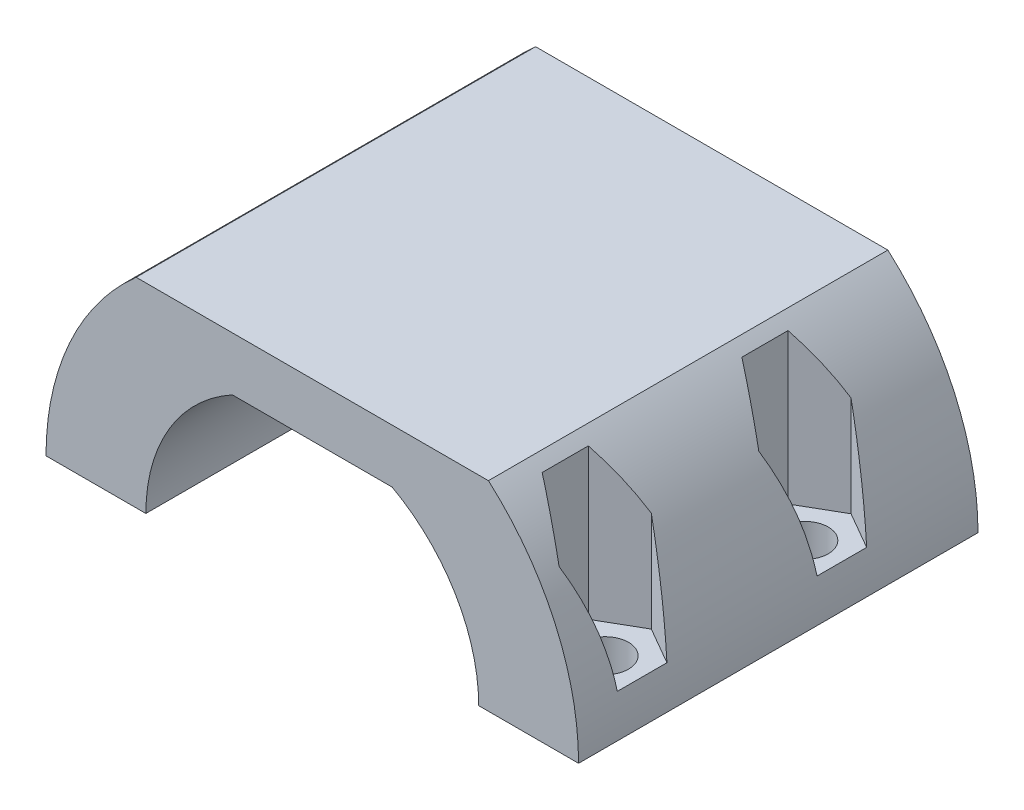
ISO-10303-21;
HEADER;
FILE_DESCRIPTION(('STEP AP214'),'2;1');
FILE_NAME('part.step','',(''),(''),'','','');
FILE_SCHEMA(('AUTOMOTIVE_DESIGN { 1 0 10303 214 1 1 1 1 }'));
ENDSEC;
DATA;
#1=APPLICATION_CONTEXT('core data for automotive mechanical design processes');
#2=APPLICATION_PROTOCOL_DEFINITION('international standard','automotive_design',2000,#1);
#3=PRODUCT_CONTEXT('',#1,'mechanical');
#4=PRODUCT('Part','Part','',(#3));
#5=PRODUCT_RELATED_PRODUCT_CATEGORY('part','',(#4));
#6=PRODUCT_DEFINITION_FORMATION('','',#4);
#7=PRODUCT_DEFINITION_CONTEXT('part definition',#1,'design');
#8=PRODUCT_DEFINITION('design','',#6,#7);
#9=PRODUCT_DEFINITION_SHAPE('','',#8);
#10=(LENGTH_UNIT() NAMED_UNIT(*) SI_UNIT(.MILLI.,.METRE.));
#11=(NAMED_UNIT(*) PLANE_ANGLE_UNIT() SI_UNIT($,.RADIAN.));
#12=(NAMED_UNIT(*) SI_UNIT($,.STERADIAN.) SOLID_ANGLE_UNIT());
#13=UNCERTAINTY_MEASURE_WITH_UNIT(LENGTH_MEASURE(1.E-05),#10,'distance_accuracy_value','');
#14=(GEOMETRIC_REPRESENTATION_CONTEXT(3) GLOBAL_UNCERTAINTY_ASSIGNED_CONTEXT((#13)) GLOBAL_UNIT_ASSIGNED_CONTEXT((#10,
#11,#12)) REPRESENTATION_CONTEXT('',''));
#15=CARTESIAN_POINT('',(0.,0.,0.));
#16=DIRECTION('',(0.,0.,1.));
#17=DIRECTION('',(1.,0.,0.));
#18=AXIS2_PLACEMENT_3D('',#15,#16,#17);
#19=CARTESIAN_POINT('',(0.,0.,30.));
#20=DIRECTION('',(0.,0.,-1.));
#21=DIRECTION('',(-1.,0.,0.));
#22=AXIS2_PLACEMENT_3D('',#19,#20,#21);
#23=CYLINDRICAL_SURFACE('',#22,20.);
#24=CARTESIAN_POINT('',(0.,0.,18.6491470389141));
#25=DIRECTION('',(-0.5,0.,-0.866025403784439));
#26=DIRECTION('',(0.866025403784439,0.,-0.5));
#27=AXIS2_PLACEMENT_3D('',#24,#25,#26);
#28=ELLIPSE('',#27,23.094010767585,20.);
#29=CARTESIAN_POINT('',(-17.,10.5356537528527,28.4641016151377));
#30=VERTEX_POINT('',#29);
#31=CARTESIAN_POINT('',(-14.,14.2828568570857,26.7320508075689));
#32=VERTEX_POINT('',#31);
#33=EDGE_CURVE('E317',#30,#32,#28,.T.);
#34=ORIENTED_EDGE('',*,*,#33,.F.);
#35=CARTESIAN_POINT('',(0.,0.,38.2790561913614));
#36=DIRECTION('',(0.499999999999999,0.,-0.866025403784439));
#37=DIRECTION('',(-0.866025403784439,0.,-0.499999999999999));
#38=AXIS2_PLACEMENT_3D('',#35,#36,#37);
#39=ELLIPSE('',#38,23.094010767585,20.);
#40=CARTESIAN_POINT('',(-19.7737199332852,3.,26.8626936649989));
#41=VERTEX_POINT('',#40);
#42=EDGE_CURVE('E308',#41,#30,#39,.T.);
#43=ORIENTED_EDGE('',*,*,#42,.F.);
#44=DIRECTION('',(0.,0.,-1.));
#45=VECTOR('',#44,1.);
#46=CARTESIAN_POINT('',(-19.7737199332852,3.,30.));
#47=LINE('',#46,#45);
#48=CARTESIAN_POINT('',(-19.7737199332852,3.,23.1373063350011));
#49=VERTEX_POINT('',#48);
#50=EDGE_CURVE('E293',#49,#41,#47,.F.);
#51=ORIENTED_EDGE('',*,*,#50,.F.);
#52=CARTESIAN_POINT('',(0.,0.,11.7209438086386));
#53=DIRECTION('',(0.5,0.,0.866025403784439));
#54=DIRECTION('',(0.866025403784439,0.,-0.5));
#55=AXIS2_PLACEMENT_3D('',#52,#53,#54);
#56=ELLIPSE('',#55,23.094010767585,20.);
#57=CARTESIAN_POINT('',(-17.,10.5356537528527,21.5358983848622));
#58=VERTEX_POINT('',#57);
#59=EDGE_CURVE('E310',#58,#49,#56,.T.);
#60=ORIENTED_EDGE('',*,*,#59,.F.);
#61=CARTESIAN_POINT('',(0.,0.,31.3508529610859));
#62=DIRECTION('',(-0.5,0.,0.866025403784439));
#63=DIRECTION('',(-0.866025403784439,0.,-0.5));
#64=AXIS2_PLACEMENT_3D('',#61,#62,#63);
#65=ELLIPSE('',#64,23.094010767585,20.);
#66=CARTESIAN_POINT('',(-14.,14.2828568570857,23.2679491924311));
#67=VERTEX_POINT('',#66);
#68=EDGE_CURVE('E313',#67,#58,#65,.T.);
#69=ORIENTED_EDGE('',*,*,#68,.F.);
#70=DIRECTION('',(0.,0.,-1.));
#71=VECTOR('',#70,1.);
#72=CARTESIAN_POINT('',(-14.,14.2828568570857,30.));
#73=LINE('',#72,#71);
#74=EDGE_CURVE('E315',#32,#67,#73,.T.);
#75=ORIENTED_EDGE('',*,*,#74,.F.);
#76=EDGE_LOOP('',(#34,#43,#51,#60,#69,#75));
#77=FACE_BOUND('',#76,.T.);
#78=CARTESIAN_POINT('',(0.,0.,3.64914703891413));
#79=DIRECTION('',(-0.5,0.,-0.866025403784439));
#80=DIRECTION('',(0.866025403784439,0.,-0.5));
#81=AXIS2_PLACEMENT_3D('',#78,#79,#80);
#82=ELLIPSE('',#81,23.094010767585,20.);
#83=CARTESIAN_POINT('',(-17.,10.5356537528527,13.4641016151378));
#84=VERTEX_POINT('',#83);
#85=CARTESIAN_POINT('',(-14.,14.2828568570857,11.7320508075689));
#86=VERTEX_POINT('',#85);
#87=EDGE_CURVE('E306',#84,#86,#82,.T.);
#88=ORIENTED_EDGE('',*,*,#87,.F.);
#89=CARTESIAN_POINT('',(0.,0.,23.2790561913614));
#90=DIRECTION('',(0.5,0.,-0.866025403784439));
#91=DIRECTION('',(-0.866025403784439,0.,-0.5));
#92=AXIS2_PLACEMENT_3D('',#89,#90,#91);
#93=ELLIPSE('',#92,23.094010767585,20.);
#94=CARTESIAN_POINT('',(-19.7737199332852,3.,11.8626936649989));
#95=VERTEX_POINT('',#94);
#96=EDGE_CURVE('E280',#95,#84,#93,.T.);
#97=ORIENTED_EDGE('',*,*,#96,.F.);
#98=DIRECTION('',(0.,0.,-1.));
#99=VECTOR('',#98,1.);
#100=CARTESIAN_POINT('',(-19.7737199332852,3.,30.));
#101=LINE('',#100,#99);
#102=CARTESIAN_POINT('',(-19.7737199332852,3.,8.13730633500108));
#103=VERTEX_POINT('',#102);
#104=EDGE_CURVE('E297',#103,#95,#101,.F.);
#105=ORIENTED_EDGE('',*,*,#104,.F.);
#106=CARTESIAN_POINT('',(0.,0.,-3.27905619136141));
#107=DIRECTION('',(0.5,0.,0.866025403784438));
#108=DIRECTION('',(0.866025403784438,0.,-0.5));
#109=AXIS2_PLACEMENT_3D('',#106,#107,#108);
#110=ELLIPSE('',#109,23.094010767585,20.);
#111=CARTESIAN_POINT('',(-17.,10.5356537528527,6.53589838486224));
#112=VERTEX_POINT('',#111);
#113=EDGE_CURVE('E299',#112,#103,#110,.T.);
#114=ORIENTED_EDGE('',*,*,#113,.F.);
#115=CARTESIAN_POINT('',(0.,0.,16.3508529610859));
#116=DIRECTION('',(-0.5,0.,0.866025403784439));
#117=DIRECTION('',(-0.866025403784439,0.,-0.5));
#118=AXIS2_PLACEMENT_3D('',#115,#116,#117);
#119=ELLIPSE('',#118,23.094010767585,20.);
#120=CARTESIAN_POINT('',(-14.,14.2828568570857,8.26794919243112));
#121=VERTEX_POINT('',#120);
#122=EDGE_CURVE('E302',#121,#112,#119,.T.);
#123=ORIENTED_EDGE('',*,*,#122,.F.);
#124=DIRECTION('',(0.,0.,-1.));
#125=VECTOR('',#124,1.);
#126=CARTESIAN_POINT('',(-14.,14.2828568570857,30.));
#127=LINE('',#126,#125);
#128=EDGE_CURVE('E304',#86,#121,#127,.T.);
#129=ORIENTED_EDGE('',*,*,#128,.F.);
#130=EDGE_LOOP('',(#88,#97,#105,#114,#123,#129));
#131=FACE_BOUND('',#130,.T.);
#132=CARTESIAN_POINT('',(0.,0.,30.));
#133=DIRECTION('',(0.,0.,1.));
#134=DIRECTION('',(1.,0.,0.));
#135=AXIS2_PLACEMENT_3D('',#132,#133,#134);
#136=CIRCLE('',#135,20.);
#137=CARTESIAN_POINT('',(-13.228756555323,15.,30.));
#138=VERTEX_POINT('',#137);
#139=CARTESIAN_POINT('',(-20.,0.,30.));
#140=VERTEX_POINT('',#139);
#141=EDGE_CURVE('E231',#138,#140,#136,.T.);
#142=ORIENTED_EDGE('',*,*,#141,.F.);
#143=DIRECTION('',(0.,0.,-1.));
#144=VECTOR('',#143,1.);
#145=CARTESIAN_POINT('',(-13.228756555323,15.,30.));
#146=LINE('',#145,#144);
#147=CARTESIAN_POINT('',(-13.228756555323,15.,0.));
#148=VERTEX_POINT('',#147);
#149=EDGE_CURVE('E219',#138,#148,#146,.T.);
#150=ORIENTED_EDGE('',*,*,#149,.T.);
#151=CARTESIAN_POINT('',(0.,0.,0.));
#152=DIRECTION('',(0.,0.,1.));
#153=DIRECTION('',(1.,0.,0.));
#154=AXIS2_PLACEMENT_3D('',#151,#152,#153);
#155=CIRCLE('',#154,20.);
#156=CARTESIAN_POINT('',(-20.,0.,0.));
#157=VERTEX_POINT('',#156);
#158=EDGE_CURVE('E258',#148,#157,#155,.T.);
#159=ORIENTED_EDGE('',*,*,#158,.T.);
#160=DIRECTION('',(0.,0.,-1.));
#161=VECTOR('',#160,1.);
#162=CARTESIAN_POINT('',(-20.,0.,30.));
#163=LINE('',#162,#161);
#164=EDGE_CURVE('E237',#140,#157,#163,.T.);
#165=ORIENTED_EDGE('',*,*,#164,.F.);
#166=EDGE_LOOP('',(#142,#150,#159,#165));
#167=FACE_BOUND('',#166,.T.);
#168=ADVANCED_FACE('F36',(#77,#131,#167),#23,.T.);
#169=CARTESIAN_POINT('',(0.,0.,11.7209438086386));
#170=DIRECTION('',(-0.5,0.,0.866025403784439));
#171=DIRECTION('',(-0.866025403784439,0.,-0.5));
#172=AXIS2_PLACEMENT_3D('',#169,#170,#171);
#173=ELLIPSE('',#172,23.094010767585,20.);
#174=CARTESIAN_POINT('',(19.7737199332852,3.,23.1373063350011));
#175=VERTEX_POINT('',#174);
#176=CARTESIAN_POINT('',(17.,10.5356537528527,21.5358983848622));
#177=VERTEX_POINT('',#176);
#178=EDGE_CURVE('E328',#175,#177,#173,.T.);
#179=ORIENTED_EDGE('',*,*,#178,.F.);
#180=DIRECTION('',(0.,0.,-1.));
#181=VECTOR('',#180,1.);
#182=CARTESIAN_POINT('',(19.7737199332852,3.,30.));
#183=LINE('',#182,#181);
#184=CARTESIAN_POINT('',(19.7737199332852,3.,26.8626936649989));
#185=VERTEX_POINT('',#184);
#186=EDGE_CURVE('E284',#185,#175,#183,.T.);
#187=ORIENTED_EDGE('',*,*,#186,.F.);
#188=CARTESIAN_POINT('',(0.,0.,38.2790561913614));
#189=DIRECTION('',(-0.5,0.,-0.866025403784439));
#190=DIRECTION('',(0.866025403784439,0.,-0.5));
#191=AXIS2_PLACEMENT_3D('',#188,#189,#190);
#192=ELLIPSE('',#191,23.094010767585,20.);
#193=CARTESIAN_POINT('',(17.,10.5356537528528,28.4641016151377));
#194=VERTEX_POINT('',#193);
#195=EDGE_CURVE('E319',#194,#185,#192,.T.);
#196=ORIENTED_EDGE('',*,*,#195,.F.);
#197=CARTESIAN_POINT('',(0.,0.,18.6491470389141));
#198=DIRECTION('',(0.5,0.,-0.866025403784439));
#199=DIRECTION('',(-0.866025403784439,0.,-0.5));
#200=AXIS2_PLACEMENT_3D('',#197,#198,#199);
#201=ELLIPSE('',#200,23.094010767585,20.);
#202=CARTESIAN_POINT('',(14.,14.2828568570857,26.7320508075689));
#203=VERTEX_POINT('',#202);
#204=EDGE_CURVE('E322',#203,#194,#201,.T.);
#205=ORIENTED_EDGE('',*,*,#204,.F.);
#206=DIRECTION('',(0.,0.,-1.));
#207=VECTOR('',#206,1.);
#208=CARTESIAN_POINT('',(14.,14.2828568570857,30.));
#209=LINE('',#208,#207);
#210=CARTESIAN_POINT('',(14.,14.2828568570857,23.2679491924311));
#211=VERTEX_POINT('',#210);
#212=EDGE_CURVE('E324',#211,#203,#209,.F.);
#213=ORIENTED_EDGE('',*,*,#212,.F.);
#214=CARTESIAN_POINT('',(0.,0.,31.3508529610859));
#215=DIRECTION('',(0.5,0.,0.866025403784439));
#216=DIRECTION('',(0.866025403784438,0.,-0.5));
#217=AXIS2_PLACEMENT_3D('',#214,#215,#216);
#218=ELLIPSE('',#217,23.094010767585,20.);
#219=EDGE_CURVE('E326',#177,#211,#218,.T.);
#220=ORIENTED_EDGE('',*,*,#219,.F.);
#221=EDGE_LOOP('',(#179,#187,#196,#205,#213,#220));
#222=FACE_BOUND('',#221,.T.);
#223=CARTESIAN_POINT('',(20.,0.,0.));
#224=VERTEX_POINT('',#223);
#225=CARTESIAN_POINT('',(13.228756555323,15.,0.));
#226=VERTEX_POINT('',#225);
#227=EDGE_CURVE('E259',#224,#226,#155,.T.);
#228=ORIENTED_EDGE('',*,*,#227,.T.);
#229=DIRECTION('',(0.,0.,-1.));
#230=VECTOR('',#229,1.);
#231=CARTESIAN_POINT('',(13.228756555323,15.,30.));
#232=LINE('',#231,#230);
#233=CARTESIAN_POINT('',(13.228756555323,15.,30.));
#234=VERTEX_POINT('',#233);
#235=EDGE_CURVE('E51',#226,#234,#232,.F.);
#236=ORIENTED_EDGE('',*,*,#235,.T.);
#237=CARTESIAN_POINT('',(20.,0.,30.));
#238=VERTEX_POINT('',#237);
#239=EDGE_CURVE('E234',#238,#234,#136,.T.);
#240=ORIENTED_EDGE('',*,*,#239,.F.);
#241=DIRECTION('',(0.,0.,-1.));
#242=VECTOR('',#241,1.);
#243=CARTESIAN_POINT('',(20.,0.,30.));
#244=LINE('',#243,#242);
#245=EDGE_CURVE('E268',#238,#224,#244,.T.);
#246=ORIENTED_EDGE('',*,*,#245,.T.);
#247=EDGE_LOOP('',(#228,#236,#240,#246));
#248=FACE_BOUND('',#247,.T.);
#249=CARTESIAN_POINT('',(0.,0.,16.3508529610859));
#250=DIRECTION('',(0.5,0.,0.866025403784439));
#251=DIRECTION('',(0.866025403784439,0.,-0.5));
#252=AXIS2_PLACEMENT_3D('',#249,#250,#251);
#253=ELLIPSE('',#252,23.094010767585,20.);
#254=CARTESIAN_POINT('',(17.,10.5356537528527,6.53589838486225));
#255=VERTEX_POINT('',#254);
#256=CARTESIAN_POINT('',(14.,14.2828568570857,8.26794919243112));
#257=VERTEX_POINT('',#256);
#258=EDGE_CURVE('E44',#255,#257,#253,.T.);
#259=ORIENTED_EDGE('',*,*,#258,.F.);
#260=CARTESIAN_POINT('',(0.,0.,-3.27905619136139));
#261=DIRECTION('',(-0.5,0.,0.866025403784439));
#262=DIRECTION('',(-0.866025403784439,0.,-0.5));
#263=AXIS2_PLACEMENT_3D('',#260,#261,#262);
#264=ELLIPSE('',#263,23.094010767585,20.);
#265=CARTESIAN_POINT('',(19.7737199332852,3.,8.13730633500108));
#266=VERTEX_POINT('',#265);
#267=EDGE_CURVE('E330',#266,#255,#264,.T.);
#268=ORIENTED_EDGE('',*,*,#267,.F.);
#269=DIRECTION('',(0.,0.,-1.));
#270=VECTOR('',#269,1.);
#271=CARTESIAN_POINT('',(19.7737199332852,3.,30.));
#272=LINE('',#271,#270);
#273=CARTESIAN_POINT('',(19.7737199332852,3.,11.8626936649989));
#274=VERTEX_POINT('',#273);
#275=EDGE_CURVE('E289',#274,#266,#272,.T.);
#276=ORIENTED_EDGE('',*,*,#275,.F.);
#277=CARTESIAN_POINT('',(0.,0.,23.2790561913614));
#278=DIRECTION('',(-0.5,0.,-0.866025403784439));
#279=DIRECTION('',(0.866025403784439,0.,-0.5));
#280=AXIS2_PLACEMENT_3D('',#277,#278,#279);
#281=ELLIPSE('',#280,23.094010767585,20.);
#282=CARTESIAN_POINT('',(17.,10.5356537528527,13.4641016151378));
#283=VERTEX_POINT('',#282);
#284=EDGE_CURVE('E332',#283,#274,#281,.T.);
#285=ORIENTED_EDGE('',*,*,#284,.F.);
#286=CARTESIAN_POINT('',(0.,0.,3.64914703891412));
#287=DIRECTION('',(0.5,0.,-0.866025403784439));
#288=DIRECTION('',(-0.866025403784438,0.,-0.5));
#289=AXIS2_PLACEMENT_3D('',#286,#287,#288);
#290=ELLIPSE('',#289,23.094010767585,20.);
#291=CARTESIAN_POINT('',(14.,14.2828568570857,11.7320508075689));
#292=VERTEX_POINT('',#291);
#293=EDGE_CURVE('E334',#292,#283,#290,.T.);
#294=ORIENTED_EDGE('',*,*,#293,.F.);
#295=DIRECTION('',(0.,0.,-1.));
#296=VECTOR('',#295,1.);
#297=CARTESIAN_POINT('',(14.,14.2828568570857,30.));
#298=LINE('',#297,#296);
#299=EDGE_CURVE('E336',#257,#292,#298,.F.);
#300=ORIENTED_EDGE('',*,*,#299,.F.);
#301=EDGE_LOOP('',(#259,#268,#276,#285,#294,#300));
#302=FACE_BOUND('',#301,.T.);
#303=ADVANCED_FACE('F357',(#222,#248,#302),#23,.T.);
#304=CARTESIAN_POINT('',(-17.,20.,10.));
#305=DIRECTION('',(0.,-1.,0.));
#306=DIRECTION('',(0.,0.,-1.));
#307=AXIS2_PLACEMENT_3D('',#304,#305,#306);
#308=CYLINDRICAL_SURFACE('',#307,1.75);
#309=CARTESIAN_POINT('',(-17.,0.,10.));
#310=DIRECTION('',(0.,1.,0.));
#311=DIRECTION('',(0.,0.,1.));
#312=AXIS2_PLACEMENT_3D('',#309,#310,#311);
#313=CIRCLE('',#312,1.75);
#314=CARTESIAN_POINT('',(-17.,0.,11.75));
#315=VERTEX_POINT('',#314);
#316=EDGE_CURVE('E252',#315,#315,#313,.T.);
#317=ORIENTED_EDGE('',*,*,#316,.F.);
#318=EDGE_LOOP('',(#317));
#319=FACE_BOUND('',#318,.T.);
#320=CARTESIAN_POINT('',(-17.,3.,10.));
#321=DIRECTION('',(0.,1.,0.));
#322=DIRECTION('',(0.,0.,1.));
#323=AXIS2_PLACEMENT_3D('',#320,#321,#322);
#324=CIRCLE('',#323,1.75);
#325=CARTESIAN_POINT('',(-17.,3.,11.75));
#326=VERTEX_POINT('',#325);
#327=EDGE_CURVE('E294',#326,#326,#324,.T.);
#328=ORIENTED_EDGE('',*,*,#327,.T.);
#329=EDGE_LOOP('',(#328));
#330=FACE_BOUND('',#329,.T.);
#331=ADVANCED_FACE('F522',(#319,#330),#308,.F.);
#332=CARTESIAN_POINT('',(-17.,20.,25.));
#333=DIRECTION('',(0.,-1.,0.));
#334=DIRECTION('',(0.,0.,-1.));
#335=AXIS2_PLACEMENT_3D('',#332,#333,#334);
#336=CYLINDRICAL_SURFACE('',#335,1.75);
#337=CARTESIAN_POINT('',(-17.,0.,25.));
#338=DIRECTION('',(0.,1.,0.));
#339=DIRECTION('',(0.,0.,1.));
#340=AXIS2_PLACEMENT_3D('',#337,#338,#339);
#341=CIRCLE('',#340,1.75);
#342=CARTESIAN_POINT('',(-17.,0.,26.75));
#343=VERTEX_POINT('',#342);
#344=EDGE_CURVE('E407',#343,#343,#341,.T.);
#345=ORIENTED_EDGE('',*,*,#344,.F.);
#346=EDGE_LOOP('',(#345));
#347=FACE_BOUND('',#346,.T.);
#348=CARTESIAN_POINT('',(-17.,3.,25.));
#349=DIRECTION('',(0.,1.,0.));
#350=DIRECTION('',(0.,0.,1.));
#351=AXIS2_PLACEMENT_3D('',#348,#349,#350);
#352=CIRCLE('',#351,1.75);
#353=CARTESIAN_POINT('',(-17.,3.,26.75));
#354=VERTEX_POINT('',#353);
#355=EDGE_CURVE('E290',#354,#354,#352,.T.);
#356=ORIENTED_EDGE('',*,*,#355,.T.);
#357=EDGE_LOOP('',(#356));
#358=FACE_BOUND('',#357,.T.);
#359=ADVANCED_FACE('F558',(#347,#358),#336,.F.);
#360=CARTESIAN_POINT('',(17.,20.,10.));
#361=DIRECTION('',(0.,-1.,0.));
#362=DIRECTION('',(0.,0.,-1.));
#363=AXIS2_PLACEMENT_3D('',#360,#361,#362);
#364=CYLINDRICAL_SURFACE('',#363,1.75);
#365=CARTESIAN_POINT('',(17.,0.,10.));
#366=DIRECTION('',(0.,1.,0.));
#367=DIRECTION('',(0.,0.,1.));
#368=AXIS2_PLACEMENT_3D('',#365,#366,#367);
#369=CIRCLE('',#368,1.75);
#370=CARTESIAN_POINT('',(17.,0.,11.75));
#371=VERTEX_POINT('',#370);
#372=EDGE_CURVE('E408',#371,#371,#369,.T.);
#373=ORIENTED_EDGE('',*,*,#372,.F.);
#374=EDGE_LOOP('',(#373));
#375=FACE_BOUND('',#374,.T.);
#376=CARTESIAN_POINT('',(17.,3.,10.));
#377=DIRECTION('',(0.,1.,0.));
#378=DIRECTION('',(0.,0.,1.));
#379=AXIS2_PLACEMENT_3D('',#376,#377,#378);
#380=CIRCLE('',#379,1.75);
#381=CARTESIAN_POINT('',(17.,3.,11.75));
#382=VERTEX_POINT('',#381);
#383=EDGE_CURVE('E286',#382,#382,#380,.T.);
#384=ORIENTED_EDGE('',*,*,#383,.T.);
#385=EDGE_LOOP('',(#384));
#386=FACE_BOUND('',#385,.T.);
#387=ADVANCED_FACE('F602',(#375,#386),#364,.F.);
#388=CARTESIAN_POINT('',(17.,20.,25.));
#389=DIRECTION('',(0.,-1.,0.));
#390=DIRECTION('',(0.,0.,-1.));
#391=AXIS2_PLACEMENT_3D('',#388,#389,#390);
#392=CYLINDRICAL_SURFACE('',#391,1.75);
#393=CARTESIAN_POINT('',(17.,0.,25.));
#394=DIRECTION('',(0.,1.,0.));
#395=DIRECTION('',(0.,0.,1.));
#396=AXIS2_PLACEMENT_3D('',#393,#394,#395);
#397=CIRCLE('',#396,1.75);
#398=CARTESIAN_POINT('',(17.,0.,26.75));
#399=VERTEX_POINT('',#398);
#400=EDGE_CURVE('E411',#399,#399,#397,.T.);
#401=ORIENTED_EDGE('',*,*,#400,.F.);
#402=EDGE_LOOP('',(#401));
#403=FACE_BOUND('',#402,.T.);
#404=CARTESIAN_POINT('',(17.,3.,25.));
#405=DIRECTION('',(0.,1.,0.));
#406=DIRECTION('',(0.,0.,1.));
#407=AXIS2_PLACEMENT_3D('',#404,#405,#406);
#408=CIRCLE('',#407,1.75);
#409=CARTESIAN_POINT('',(17.,3.,26.75));
#410=VERTEX_POINT('',#409);
#411=EDGE_CURVE('E281',#410,#410,#408,.T.);
#412=ORIENTED_EDGE('',*,*,#411,.T.);
#413=EDGE_LOOP('',(#412));
#414=FACE_BOUND('',#413,.T.);
#415=ADVANCED_FACE('F538',(#403,#414),#392,.F.);
#416=CARTESIAN_POINT('',(0.,0.,30.));
#417=DIRECTION('',(0.,0.,-1.));
#418=DIRECTION('',(-1.,0.,0.));
#419=AXIS2_PLACEMENT_3D('',#416,#417,#418);
#420=CYLINDRICAL_SURFACE('',#419,12.5);
#421=CARTESIAN_POINT('',(0.,0.,0.));
#422=DIRECTION('',(0.,0.,-1.));
#423=DIRECTION('',(1.,0.,0.));
#424=AXIS2_PLACEMENT_3D('',#421,#422,#423);
#425=CIRCLE('',#424,12.5);
#426=CARTESIAN_POINT('',(-12.5,0.,0.));
#427=VERTEX_POINT('',#426);
#428=CARTESIAN_POINT('',(-6.,10.9658560997307,0.));
#429=VERTEX_POINT('',#428);
#430=EDGE_CURVE('E248',#427,#429,#425,.T.);
#431=ORIENTED_EDGE('',*,*,#430,.T.);
#432=DIRECTION('',(0.,0.,-1.));
#433=VECTOR('',#432,1.);
#434=CARTESIAN_POINT('',(-6.,10.9658560997307,30.));
#435=LINE('',#434,#433);
#436=CARTESIAN_POINT('',(-6.,10.9658560997307,30.));
#437=VERTEX_POINT('',#436);
#438=EDGE_CURVE('E277',#437,#429,#435,.T.);
#439=ORIENTED_EDGE('',*,*,#438,.F.);
#440=CARTESIAN_POINT('',(0.,0.,30.));
#441=DIRECTION('',(0.,0.,-1.));
#442=DIRECTION('',(1.,0.,0.));
#443=AXIS2_PLACEMENT_3D('',#440,#441,#442);
#444=CIRCLE('',#443,12.5);
#445=CARTESIAN_POINT('',(-12.5,0.,30.));
#446=VERTEX_POINT('',#445);
#447=EDGE_CURVE('E264',#446,#437,#444,.T.);
#448=ORIENTED_EDGE('',*,*,#447,.F.);
#449=DIRECTION('',(0.,0.,-1.));
#450=VECTOR('',#449,1.);
#451=CARTESIAN_POINT('',(-12.5,0.,30.));
#452=LINE('',#451,#450);
#453=EDGE_CURVE('E247',#446,#427,#452,.T.);
#454=ORIENTED_EDGE('',*,*,#453,.T.);
#455=EDGE_LOOP('',(#431,#439,#448,#454));
#456=FACE_BOUND('',#455,.T.);
#457=ADVANCED_FACE('F38',(#456),#420,.F.);
#458=CARTESIAN_POINT('',(-6.,10.9658560997307,30.));
#459=DIRECTION('',(0.,1.,0.));
#460=DIRECTION('',(0.,0.,1.));
#461=AXIS2_PLACEMENT_3D('',#458,#459,#460);
#462=PLANE('',#461);
#463=DIRECTION('',(1.,0.,0.));
#464=VECTOR('',#463,1.);
#465=CARTESIAN_POINT('',(-6.,10.9658560997307,0.));
#466=LINE('',#465,#464);
#467=CARTESIAN_POINT('',(6.,10.9658560997307,0.));
#468=VERTEX_POINT('',#467);
#469=EDGE_CURVE('E251',#429,#468,#466,.T.);
#470=ORIENTED_EDGE('',*,*,#469,.T.);
#471=DIRECTION('',(0.,0.,-1.));
#472=VECTOR('',#471,1.);
#473=CARTESIAN_POINT('',(6.,10.9658560997307,30.));
#474=LINE('',#473,#472);
#475=CARTESIAN_POINT('',(6.,10.9658560997307,30.));
#476=VERTEX_POINT('',#475);
#477=EDGE_CURVE('E274',#476,#468,#474,.T.);
#478=ORIENTED_EDGE('',*,*,#477,.F.);
#479=DIRECTION('',(1.,0.,0.));
#480=VECTOR('',#479,1.);
#481=CARTESIAN_POINT('',(-6.,10.9658560997307,30.));
#482=LINE('',#481,#480);
#483=EDGE_CURVE('E420',#437,#476,#482,.T.);
#484=ORIENTED_EDGE('',*,*,#483,.F.);
#485=ORIENTED_EDGE('',*,*,#438,.T.);
#486=EDGE_LOOP('',(#470,#478,#484,#485));
#487=FACE_BOUND('',#486,.T.);
#488=ADVANCED_FACE('F532',(#487),#462,.F.);
#489=CARTESIAN_POINT('',(0.,0.,30.));
#490=DIRECTION('',(0.,0.,-1.));
#491=DIRECTION('',(-1.,0.,0.));
#492=AXIS2_PLACEMENT_3D('',#489,#490,#491);
#493=CYLINDRICAL_SURFACE('',#492,12.5);
#494=CARTESIAN_POINT('',(0.,0.,0.));
#495=DIRECTION('',(0.,0.,-1.));
#496=DIRECTION('',(1.,0.,0.));
#497=AXIS2_PLACEMENT_3D('',#494,#495,#496);
#498=CIRCLE('',#497,12.5);
#499=CARTESIAN_POINT('',(12.5,0.,0.));
#500=VERTEX_POINT('',#499);
#501=EDGE_CURVE('E254',#468,#500,#498,.T.);
#502=ORIENTED_EDGE('',*,*,#501,.T.);
#503=DIRECTION('',(0.,0.,-1.));
#504=VECTOR('',#503,1.);
#505=CARTESIAN_POINT('',(12.5,0.,30.));
#506=LINE('',#505,#504);
#507=CARTESIAN_POINT('',(12.5,0.,30.));
#508=VERTEX_POINT('',#507);
#509=EDGE_CURVE('E271',#508,#500,#506,.T.);
#510=ORIENTED_EDGE('',*,*,#509,.F.);
#511=CARTESIAN_POINT('',(0.,0.,30.));
#512=DIRECTION('',(0.,0.,-1.));
#513=DIRECTION('',(1.,0.,0.));
#514=AXIS2_PLACEMENT_3D('',#511,#512,#513);
#515=CIRCLE('',#514,12.5);
#516=EDGE_CURVE('E242',#476,#508,#515,.T.);
#517=ORIENTED_EDGE('',*,*,#516,.F.);
#518=ORIENTED_EDGE('',*,*,#477,.T.);
#519=EDGE_LOOP('',(#502,#510,#517,#518));
#520=FACE_BOUND('',#519,.T.);
#521=ADVANCED_FACE('F427',(#520),#493,.F.);
#522=CARTESIAN_POINT('',(12.5,0.,30.));
#523=DIRECTION('',(0.,1.,0.));
#524=DIRECTION('',(-1.,0.,0.));
#525=AXIS2_PLACEMENT_3D('',#522,#523,#524);
#526=PLANE('',#525);
#527=ORIENTED_EDGE('',*,*,#400,.T.);
#528=EDGE_LOOP('',(#527));
#529=FACE_BOUND('',#528,.T.);
#530=ORIENTED_EDGE('',*,*,#372,.T.);
#531=EDGE_LOOP('',(#530));
#532=FACE_BOUND('',#531,.T.);
#533=DIRECTION('',(1.,0.,0.));
#534=VECTOR('',#533,1.);
#535=CARTESIAN_POINT('',(12.5,0.,0.));
#536=LINE('',#535,#534);
#537=EDGE_CURVE('E256',#500,#224,#536,.T.);
#538=ORIENTED_EDGE('',*,*,#537,.T.);
#539=ORIENTED_EDGE('',*,*,#245,.F.);
#540=DIRECTION('',(1.,0.,0.));
#541=VECTOR('',#540,1.);
#542=CARTESIAN_POINT('',(12.5,0.,30.));
#543=LINE('',#542,#541);
#544=EDGE_CURVE('E239',#508,#238,#543,.T.);
#545=ORIENTED_EDGE('',*,*,#544,.F.);
#546=ORIENTED_EDGE('',*,*,#509,.T.);
#547=EDGE_LOOP('',(#538,#539,#545,#546));
#548=FACE_BOUND('',#547,.T.);
#549=ADVANCED_FACE('F431',(#529,#532,#548),#526,.F.);
#550=CARTESIAN_POINT('',(-20.,0.,30.));
#551=DIRECTION('',(0.,1.,0.));
#552=DIRECTION('',(0.,0.,1.));
#553=AXIS2_PLACEMENT_3D('',#550,#551,#552);
#554=PLANE('',#553);
#555=ORIENTED_EDGE('',*,*,#344,.T.);
#556=EDGE_LOOP('',(#555));
#557=FACE_BOUND('',#556,.T.);
#558=ORIENTED_EDGE('',*,*,#316,.T.);
#559=EDGE_LOOP('',(#558));
#560=FACE_BOUND('',#559,.T.);
#561=DIRECTION('',(1.,0.,0.));
#562=VECTOR('',#561,1.);
#563=CARTESIAN_POINT('',(-20.,0.,0.));
#564=LINE('',#563,#562);
#565=EDGE_CURVE('E262',#157,#427,#564,.T.);
#566=ORIENTED_EDGE('',*,*,#565,.T.);
#567=ORIENTED_EDGE('',*,*,#453,.F.);
#568=DIRECTION('',(1.,0.,0.));
#569=VECTOR('',#568,1.);
#570=CARTESIAN_POINT('',(-20.,0.,30.));
#571=LINE('',#570,#569);
#572=EDGE_CURVE('E241',#140,#446,#571,.T.);
#573=ORIENTED_EDGE('',*,*,#572,.F.);
#574=ORIENTED_EDGE('',*,*,#164,.T.);
#575=EDGE_LOOP('',(#566,#567,#573,#574));
#576=FACE_BOUND('',#575,.T.);
#577=ADVANCED_FACE('F527',(#557,#560,#576),#554,.F.);
#578=CARTESIAN_POINT('',(0.,0.,30.));
#579=DIRECTION('',(0.,0.,1.));
#580=DIRECTION('',(1.,0.,0.));
#581=AXIS2_PLACEMENT_3D('',#578,#579,#580);
#582=PLANE('',#581);
#583=DIRECTION('',(1.,0.,0.));
#584=VECTOR('',#583,1.);
#585=CARTESIAN_POINT('',(-16.8059357835349,15.,30.));
#586=LINE('',#585,#584);
#587=EDGE_CURVE('E222',#138,#234,#586,.T.);
#588=ORIENTED_EDGE('',*,*,#587,.F.);
#589=ORIENTED_EDGE('',*,*,#141,.T.);
#590=ORIENTED_EDGE('',*,*,#572,.T.);
#591=ORIENTED_EDGE('',*,*,#447,.T.);
#592=ORIENTED_EDGE('',*,*,#483,.T.);
#593=ORIENTED_EDGE('',*,*,#516,.T.);
#594=ORIENTED_EDGE('',*,*,#544,.T.);
#595=ORIENTED_EDGE('',*,*,#239,.T.);
#596=EDGE_LOOP('',(#588,#589,#590,#591,#592,#593,#594,#595));
#597=FACE_BOUND('',#596,.T.);
#598=ADVANCED_FACE('F230',(#597),#582,.T.);
#599=CARTESIAN_POINT('',(0.,0.,0.));
#600=DIRECTION('',(0.,0.,1.));
#601=DIRECTION('',(1.,0.,0.));
#602=AXIS2_PLACEMENT_3D('',#599,#600,#601);
#603=PLANE('',#602);
#604=ORIENTED_EDGE('',*,*,#158,.F.);
#605=DIRECTION('',(1.,0.,0.));
#606=VECTOR('',#605,1.);
#607=CARTESIAN_POINT('',(0.,15.,0.));
#608=LINE('',#607,#606);
#609=EDGE_CURVE('E11',#148,#226,#608,.T.);
#610=ORIENTED_EDGE('',*,*,#609,.T.);
#611=ORIENTED_EDGE('',*,*,#227,.F.);
#612=ORIENTED_EDGE('',*,*,#537,.F.);
#613=ORIENTED_EDGE('',*,*,#501,.F.);
#614=ORIENTED_EDGE('',*,*,#469,.F.);
#615=ORIENTED_EDGE('',*,*,#430,.F.);
#616=ORIENTED_EDGE('',*,*,#565,.F.);
#617=EDGE_LOOP('',(#604,#610,#611,#612,#613,#614,#615,#616));
#618=FACE_BOUND('',#617,.T.);
#619=ADVANCED_FACE('F506',(#618),#603,.F.);
#620=CARTESIAN_POINT('',(20.,20.,23.2679491924311));
#621=DIRECTION('',(-0.5,0.,0.866025403784439));
#622=DIRECTION('',(0.866025403784439,0.,0.5));
#623=AXIS2_PLACEMENT_3D('',#620,#621,#622);
#624=PLANE('',#623);
#625=ORIENTED_EDGE('',*,*,#178,.T.);
#626=DIRECTION('',(0.,-1.,0.));
#627=VECTOR('',#626,1.);
#628=CARTESIAN_POINT('',(17.,20.,21.5358983848622));
#629=LINE('',#628,#627);
#630=CARTESIAN_POINT('',(17.,3.,21.5358983848622));
#631=VERTEX_POINT('',#630);
#632=EDGE_CURVE('E380',#177,#631,#629,.T.);
#633=ORIENTED_EDGE('',*,*,#632,.T.);
#634=DIRECTION('',(-0.866025403784439,0.,-0.5));
#635=VECTOR('',#634,1.);
#636=CARTESIAN_POINT('',(20.,3.,23.2679491924311));
#637=LINE('',#636,#635);
#638=EDGE_CURVE('E439',#175,#631,#637,.T.);
#639=ORIENTED_EDGE('',*,*,#638,.F.);
#640=EDGE_LOOP('',(#625,#633,#639));
#641=FACE_BOUND('',#640,.T.);
#642=ADVANCED_FACE('F504',(#641),#624,.T.);
#643=CARTESIAN_POINT('',(17.,20.,21.5358983848622));
#644=DIRECTION('',(0.5,0.,0.866025403784439));
#645=DIRECTION('',(0.866025403784438,0.,-0.5));
#646=AXIS2_PLACEMENT_3D('',#643,#644,#645);
#647=PLANE('',#646);
#648=ORIENTED_EDGE('',*,*,#219,.T.);
#649=DIRECTION('',(0.,-1.,0.));
#650=VECTOR('',#649,1.);
#651=CARTESIAN_POINT('',(14.,20.,23.2679491924311));
#652=LINE('',#651,#650);
#653=CARTESIAN_POINT('',(14.,3.,23.2679491924311));
#654=VERTEX_POINT('',#653);
#655=EDGE_CURVE('E459',#211,#654,#652,.T.);
#656=ORIENTED_EDGE('',*,*,#655,.T.);
#657=DIRECTION('',(-0.866025403784438,0.,0.5));
#658=VECTOR('',#657,1.);
#659=CARTESIAN_POINT('',(17.,3.,21.5358983848622));
#660=LINE('',#659,#658);
#661=EDGE_CURVE('E473',#631,#654,#660,.T.);
#662=ORIENTED_EDGE('',*,*,#661,.F.);
#663=ORIENTED_EDGE('',*,*,#632,.F.);
#664=EDGE_LOOP('',(#648,#656,#662,#663));
#665=FACE_BOUND('',#664,.T.);
#666=ADVANCED_FACE('F487',(#665),#647,.T.);
#667=CARTESIAN_POINT('',(14.,20.,23.2679491924311));
#668=DIRECTION('',(1.,0.,0.));
#669=DIRECTION('',(0.,0.,-1.));
#670=AXIS2_PLACEMENT_3D('',#667,#668,#669);
#671=PLANE('',#670);
#672=ORIENTED_EDGE('',*,*,#212,.T.);
#673=DIRECTION('',(0.,-1.,0.));
#674=VECTOR('',#673,1.);
#675=CARTESIAN_POINT('',(14.,20.,26.7320508075689));
#676=LINE('',#675,#674);
#677=CARTESIAN_POINT('',(14.,3.,26.7320508075689));
#678=VERTEX_POINT('',#677);
#679=EDGE_CURVE('E461',#203,#678,#676,.T.);
#680=ORIENTED_EDGE('',*,*,#679,.T.);
#681=DIRECTION('',(0.,0.,1.));
#682=VECTOR('',#681,1.);
#683=CARTESIAN_POINT('',(14.,3.,23.2679491924311));
#684=LINE('',#683,#682);
#685=EDGE_CURVE('E470',#654,#678,#684,.T.);
#686=ORIENTED_EDGE('',*,*,#685,.F.);
#687=ORIENTED_EDGE('',*,*,#655,.F.);
#688=EDGE_LOOP('',(#672,#680,#686,#687));
#689=FACE_BOUND('',#688,.T.);
#690=ADVANCED_FACE('F492',(#689),#671,.T.);
#691=CARTESIAN_POINT('',(14.,20.,26.7320508075689));
#692=DIRECTION('',(0.5,0.,-0.866025403784439));
#693=DIRECTION('',(-0.866025403784439,0.,-0.5));
#694=AXIS2_PLACEMENT_3D('',#691,#692,#693);
#695=PLANE('',#694);
#696=ORIENTED_EDGE('',*,*,#204,.T.);
#697=DIRECTION('',(0.,-1.,0.));
#698=VECTOR('',#697,1.);
#699=CARTESIAN_POINT('',(17.,20.,28.4641016151377));
#700=LINE('',#699,#698);
#701=CARTESIAN_POINT('',(17.,3.,28.4641016151377));
#702=VERTEX_POINT('',#701);
#703=EDGE_CURVE('E463',#194,#702,#700,.T.);
#704=ORIENTED_EDGE('',*,*,#703,.T.);
#705=DIRECTION('',(0.866025403784439,0.,0.5));
#706=VECTOR('',#705,1.);
#707=CARTESIAN_POINT('',(14.,3.,26.7320508075689));
#708=LINE('',#707,#706);
#709=EDGE_CURVE('E467',#678,#702,#708,.T.);
#710=ORIENTED_EDGE('',*,*,#709,.F.);
#711=ORIENTED_EDGE('',*,*,#679,.F.);
#712=EDGE_LOOP('',(#696,#704,#710,#711));
#713=FACE_BOUND('',#712,.T.);
#714=ADVANCED_FACE('F499',(#713),#695,.T.);
#715=CARTESIAN_POINT('',(17.,20.,28.4641016151377));
#716=DIRECTION('',(-0.5,0.,-0.866025403784439));
#717=DIRECTION('',(-0.866025403784439,0.,0.5));
#718=AXIS2_PLACEMENT_3D('',#715,#716,#717);
#719=PLANE('',#718);
#720=ORIENTED_EDGE('',*,*,#195,.T.);
#721=DIRECTION('',(0.866025403784439,0.,-0.5));
#722=VECTOR('',#721,1.);
#723=CARTESIAN_POINT('',(17.,3.,28.4641016151377));
#724=LINE('',#723,#722);
#725=EDGE_CURVE('E465',#702,#185,#724,.T.);
#726=ORIENTED_EDGE('',*,*,#725,.F.);
#727=ORIENTED_EDGE('',*,*,#703,.F.);
#728=EDGE_LOOP('',(#720,#726,#727));
#729=FACE_BOUND('',#728,.T.);
#730=ADVANCED_FACE('F503',(#729),#719,.T.);
#731=CARTESIAN_POINT('',(0.,3.,0.));
#732=DIRECTION('',(0.,1.,0.));
#733=DIRECTION('',(0.,0.,1.));
#734=AXIS2_PLACEMENT_3D('',#731,#732,#733);
#735=PLANE('',#734);
#736=ORIENTED_EDGE('',*,*,#411,.F.);
#737=EDGE_LOOP('',(#736));
#738=FACE_BOUND('',#737,.T.);
#739=ORIENTED_EDGE('',*,*,#186,.T.);
#740=ORIENTED_EDGE('',*,*,#638,.T.);
#741=ORIENTED_EDGE('',*,*,#661,.T.);
#742=ORIENTED_EDGE('',*,*,#685,.T.);
#743=ORIENTED_EDGE('',*,*,#709,.T.);
#744=ORIENTED_EDGE('',*,*,#725,.T.);
#745=EDGE_LOOP('',(#739,#740,#741,#742,#743,#744));
#746=FACE_BOUND('',#745,.T.);
#747=ADVANCED_FACE('F480',(#738,#746),#735,.T.);
#748=CARTESIAN_POINT('',(17.,20.,6.53589838486225));
#749=DIRECTION('',(0.5,0.,0.866025403784439));
#750=DIRECTION('',(0.866025403784439,0.,-0.5));
#751=AXIS2_PLACEMENT_3D('',#748,#749,#750);
#752=PLANE('',#751);
#753=ORIENTED_EDGE('',*,*,#258,.T.);
#754=DIRECTION('',(0.,-1.,0.));
#755=VECTOR('',#754,1.);
#756=CARTESIAN_POINT('',(14.,20.,8.26794919243112));
#757=LINE('',#756,#755);
#758=CARTESIAN_POINT('',(14.,3.,8.26794919243112));
#759=VERTEX_POINT('',#758);
#760=EDGE_CURVE('E226',#257,#759,#757,.T.);
#761=ORIENTED_EDGE('',*,*,#760,.T.);
#762=DIRECTION('',(-0.866025403784439,0.,0.5));
#763=VECTOR('',#762,1.);
#764=CARTESIAN_POINT('',(17.,3.,6.53589838486225));
#765=LINE('',#764,#763);
#766=CARTESIAN_POINT('',(17.,3.,6.53589838486225));
#767=VERTEX_POINT('',#766);
#768=EDGE_CURVE('E378',#767,#759,#765,.T.);
#769=ORIENTED_EDGE('',*,*,#768,.F.);
#770=DIRECTION('',(0.,-1.,0.));
#771=VECTOR('',#770,1.);
#772=CARTESIAN_POINT('',(17.,20.,6.53589838486225));
#773=LINE('',#772,#771);
#774=EDGE_CURVE('E344',#255,#767,#773,.T.);
#775=ORIENTED_EDGE('',*,*,#774,.F.);
#776=EDGE_LOOP('',(#753,#761,#769,#775));
#777=FACE_BOUND('',#776,.T.);
#778=ADVANCED_FACE('F341',(#777),#752,.T.);
#779=CARTESIAN_POINT('',(14.,20.,8.26794919243112));
#780=DIRECTION('',(1.,0.,0.));
#781=DIRECTION('',(0.,0.,-1.));
#782=AXIS2_PLACEMENT_3D('',#779,#780,#781);
#783=PLANE('',#782);
#784=ORIENTED_EDGE('',*,*,#299,.T.);
#785=DIRECTION('',(0.,-1.,0.));
#786=VECTOR('',#785,1.);
#787=CARTESIAN_POINT('',(14.,20.,11.7320508075689));
#788=LINE('',#787,#786);
#789=CARTESIAN_POINT('',(14.,3.,11.7320508075689));
#790=VERTEX_POINT('',#789);
#791=EDGE_CURVE('E354',#292,#790,#788,.T.);
#792=ORIENTED_EDGE('',*,*,#791,.T.);
#793=DIRECTION('',(0.,0.,1.));
#794=VECTOR('',#793,1.);
#795=CARTESIAN_POINT('',(14.,3.,8.26794919243112));
#796=LINE('',#795,#794);
#797=EDGE_CURVE('E352',#759,#790,#796,.T.);
#798=ORIENTED_EDGE('',*,*,#797,.F.);
#799=ORIENTED_EDGE('',*,*,#760,.F.);
#800=EDGE_LOOP('',(#784,#792,#798,#799));
#801=FACE_BOUND('',#800,.T.);
#802=ADVANCED_FACE('F349',(#801),#783,.T.);
#803=CARTESIAN_POINT('',(14.,20.,11.7320508075689));
#804=DIRECTION('',(0.5,0.,-0.866025403784439));
#805=DIRECTION('',(-0.866025403784438,0.,-0.5));
#806=AXIS2_PLACEMENT_3D('',#803,#804,#805);
#807=PLANE('',#806);
#808=ORIENTED_EDGE('',*,*,#293,.T.);
#809=DIRECTION('',(0.,-1.,0.));
#810=VECTOR('',#809,1.);
#811=CARTESIAN_POINT('',(17.,20.,13.4641016151378));
#812=LINE('',#811,#810);
#813=CARTESIAN_POINT('',(17.,3.,13.4641016151378));
#814=VERTEX_POINT('',#813);
#815=EDGE_CURVE('E364',#283,#814,#812,.T.);
#816=ORIENTED_EDGE('',*,*,#815,.T.);
#817=DIRECTION('',(0.866025403784438,0.,0.5));
#818=VECTOR('',#817,1.);
#819=CARTESIAN_POINT('',(14.,3.,11.7320508075689));
#820=LINE('',#819,#818);
#821=EDGE_CURVE('E375',#790,#814,#820,.T.);
#822=ORIENTED_EDGE('',*,*,#821,.F.);
#823=ORIENTED_EDGE('',*,*,#791,.F.);
#824=EDGE_LOOP('',(#808,#816,#822,#823));
#825=FACE_BOUND('',#824,.T.);
#826=ADVANCED_FACE('F362',(#825),#807,.T.);
#827=CARTESIAN_POINT('',(17.,20.,13.4641016151378));
#828=DIRECTION('',(-0.5,0.,-0.866025403784439));
#829=DIRECTION('',(-0.866025403784439,0.,0.5));
#830=AXIS2_PLACEMENT_3D('',#827,#828,#829);
#831=PLANE('',#830);
#832=ORIENTED_EDGE('',*,*,#284,.T.);
#833=DIRECTION('',(0.866025403784439,0.,-0.5));
#834=VECTOR('',#833,1.);
#835=CARTESIAN_POINT('',(17.,3.,13.4641016151378));
#836=LINE('',#835,#834);
#837=EDGE_CURVE('E58',#814,#274,#836,.T.);
#838=ORIENTED_EDGE('',*,*,#837,.F.);
#839=ORIENTED_EDGE('',*,*,#815,.F.);
#840=EDGE_LOOP('',(#832,#838,#839));
#841=FACE_BOUND('',#840,.T.);
#842=ADVANCED_FACE('F366',(#841),#831,.T.);
#843=CARTESIAN_POINT('',(20.,20.,8.26794919243112));
#844=DIRECTION('',(-0.5,0.,0.866025403784439));
#845=DIRECTION('',(0.866025403784439,0.,0.5));
#846=AXIS2_PLACEMENT_3D('',#843,#844,#845);
#847=PLANE('',#846);
#848=ORIENTED_EDGE('',*,*,#267,.T.);
#849=ORIENTED_EDGE('',*,*,#774,.T.);
#850=DIRECTION('',(-0.866025403784439,0.,-0.5));
#851=VECTOR('',#850,1.);
#852=CARTESIAN_POINT('',(20.,3.,8.26794919243112));
#853=LINE('',#852,#851);
#854=EDGE_CURVE('E368',#266,#767,#853,.T.);
#855=ORIENTED_EDGE('',*,*,#854,.F.);
#856=EDGE_LOOP('',(#848,#849,#855));
#857=FACE_BOUND('',#856,.T.);
#858=ADVANCED_FACE('F845',(#857),#847,.T.);
#859=CARTESIAN_POINT('',(0.,3.,0.));
#860=DIRECTION('',(0.,1.,0.));
#861=DIRECTION('',(0.,0.,1.));
#862=AXIS2_PLACEMENT_3D('',#859,#860,#861);
#863=PLANE('',#862);
#864=ORIENTED_EDGE('',*,*,#383,.F.);
#865=EDGE_LOOP('',(#864));
#866=FACE_BOUND('',#865,.T.);
#867=ORIENTED_EDGE('',*,*,#275,.T.);
#868=ORIENTED_EDGE('',*,*,#854,.T.);
#869=ORIENTED_EDGE('',*,*,#768,.T.);
#870=ORIENTED_EDGE('',*,*,#797,.T.);
#871=ORIENTED_EDGE('',*,*,#821,.T.);
#872=ORIENTED_EDGE('',*,*,#837,.T.);
#873=EDGE_LOOP('',(#867,#868,#869,#870,#871,#872));
#874=FACE_BOUND('',#873,.T.);
#875=ADVANCED_FACE('F649',(#866,#874),#863,.T.);
#876=CARTESIAN_POINT('',(-14.,20.,23.2679491924311));
#877=DIRECTION('',(-0.5,0.,0.866025403784439));
#878=DIRECTION('',(0.866025403784439,0.,0.5));
#879=AXIS2_PLACEMENT_3D('',#876,#877,#878);
#880=PLANE('',#879);
#881=ORIENTED_EDGE('',*,*,#68,.T.);
#882=DIRECTION('',(0.,-1.,0.));
#883=VECTOR('',#882,1.);
#884=CARTESIAN_POINT('',(-17.,20.,21.5358983848622));
#885=LINE('',#884,#883);
#886=CARTESIAN_POINT('',(-17.,3.,21.5358983848622));
#887=VERTEX_POINT('',#886);
#888=EDGE_CURVE('E436',#58,#887,#885,.T.);
#889=ORIENTED_EDGE('',*,*,#888,.T.);
#890=DIRECTION('',(-0.866025403784439,0.,-0.5));
#891=VECTOR('',#890,1.);
#892=CARTESIAN_POINT('',(-14.,3.,23.2679491924311));
#893=LINE('',#892,#891);
#894=CARTESIAN_POINT('',(-14.,3.,23.2679491924311));
#895=VERTEX_POINT('',#894);
#896=EDGE_CURVE('E385',#895,#887,#893,.T.);
#897=ORIENTED_EDGE('',*,*,#896,.F.);
#898=DIRECTION('',(0.,-1.,0.));
#899=VECTOR('',#898,1.);
#900=CARTESIAN_POINT('',(-14.,20.,23.2679491924311));
#901=LINE('',#900,#899);
#902=EDGE_CURVE('E443',#67,#895,#901,.T.);
#903=ORIENTED_EDGE('',*,*,#902,.F.);
#904=EDGE_LOOP('',(#881,#889,#897,#903));
#905=FACE_BOUND('',#904,.T.);
#906=ADVANCED_FACE('F638',(#905),#880,.T.);
#907=CARTESIAN_POINT('',(-17.,20.,21.5358983848622));
#908=DIRECTION('',(0.5,0.,0.866025403784439));
#909=DIRECTION('',(0.866025403784439,0.,-0.5));
#910=AXIS2_PLACEMENT_3D('',#907,#908,#909);
#911=PLANE('',#910);
#912=ORIENTED_EDGE('',*,*,#59,.T.);
#913=DIRECTION('',(-0.866025403784439,0.,0.5));
#914=VECTOR('',#913,1.);
#915=CARTESIAN_POINT('',(-17.,3.,21.5358983848622));
#916=LINE('',#915,#914);
#917=EDGE_CURVE('E454',#887,#49,#916,.T.);
#918=ORIENTED_EDGE('',*,*,#917,.F.);
#919=ORIENTED_EDGE('',*,*,#888,.F.);
#920=EDGE_LOOP('',(#912,#918,#919));
#921=FACE_BOUND('',#920,.T.);
#922=ADVANCED_FACE('F641',(#921),#911,.T.);
#923=CARTESIAN_POINT('',(-20.,20.,26.7320508075689));
#924=DIRECTION('',(0.499999999999999,0.,-0.866025403784439));
#925=DIRECTION('',(-0.866025403784439,0.,-0.499999999999999));
#926=AXIS2_PLACEMENT_3D('',#923,#924,#925);
#927=PLANE('',#926);
#928=ORIENTED_EDGE('',*,*,#42,.T.);
#929=DIRECTION('',(0.,-1.,0.));
#930=VECTOR('',#929,1.);
#931=CARTESIAN_POINT('',(-17.,20.,28.4641016151377));
#932=LINE('',#931,#930);
#933=CARTESIAN_POINT('',(-17.,3.,28.4641016151377));
#934=VERTEX_POINT('',#933);
#935=EDGE_CURVE('E438',#30,#934,#932,.T.);
#936=ORIENTED_EDGE('',*,*,#935,.T.);
#937=DIRECTION('',(0.866025403784439,0.,0.499999999999999));
#938=VECTOR('',#937,1.);
#939=CARTESIAN_POINT('',(-20.,3.,26.7320508075689));
#940=LINE('',#939,#938);
#941=EDGE_CURVE('E451',#41,#934,#940,.T.);
#942=ORIENTED_EDGE('',*,*,#941,.F.);
#943=EDGE_LOOP('',(#928,#936,#942));
#944=FACE_BOUND('',#943,.T.);
#945=ADVANCED_FACE('F626',(#944),#927,.T.);
#946=CARTESIAN_POINT('',(-17.,20.,28.4641016151377));
#947=DIRECTION('',(-0.5,0.,-0.866025403784439));
#948=DIRECTION('',(-0.866025403784439,0.,0.5));
#949=AXIS2_PLACEMENT_3D('',#946,#947,#948);
#950=PLANE('',#949);
#951=ORIENTED_EDGE('',*,*,#33,.T.);
#952=DIRECTION('',(0.,-1.,0.));
#953=VECTOR('',#952,1.);
#954=CARTESIAN_POINT('',(-14.,20.,26.7320508075689));
#955=LINE('',#954,#953);
#956=CARTESIAN_POINT('',(-14.,3.,26.7320508075689));
#957=VERTEX_POINT('',#956);
#958=EDGE_CURVE('E441',#32,#957,#955,.T.);
#959=ORIENTED_EDGE('',*,*,#958,.T.);
#960=DIRECTION('',(0.866025403784439,0.,-0.5));
#961=VECTOR('',#960,1.);
#962=CARTESIAN_POINT('',(-17.,3.,28.4641016151377));
#963=LINE('',#962,#961);
#964=EDGE_CURVE('E448',#934,#957,#963,.T.);
#965=ORIENTED_EDGE('',*,*,#964,.F.);
#966=ORIENTED_EDGE('',*,*,#935,.F.);
#967=EDGE_LOOP('',(#951,#959,#965,#966));
#968=FACE_BOUND('',#967,.T.);
#969=ADVANCED_FACE('F632',(#968),#950,.T.);
#970=CARTESIAN_POINT('',(-14.,20.,26.7320508075689));
#971=DIRECTION('',(-1.,0.,0.));
#972=DIRECTION('',(0.,0.,1.));
#973=AXIS2_PLACEMENT_3D('',#970,#971,#972);
#974=PLANE('',#973);
#975=ORIENTED_EDGE('',*,*,#74,.T.);
#976=ORIENTED_EDGE('',*,*,#902,.T.);
#977=DIRECTION('',(0.,0.,-1.));
#978=VECTOR('',#977,1.);
#979=CARTESIAN_POINT('',(-14.,3.,26.7320508075689));
#980=LINE('',#979,#978);
#981=EDGE_CURVE('E445',#957,#895,#980,.T.);
#982=ORIENTED_EDGE('',*,*,#981,.F.);
#983=ORIENTED_EDGE('',*,*,#958,.F.);
#984=EDGE_LOOP('',(#975,#976,#982,#983));
#985=FACE_BOUND('',#984,.T.);
#986=ADVANCED_FACE('F618',(#985),#974,.T.);
#987=CARTESIAN_POINT('',(0.,3.,0.));
#988=DIRECTION('',(0.,1.,0.));
#989=DIRECTION('',(0.,0.,1.));
#990=AXIS2_PLACEMENT_3D('',#987,#988,#989);
#991=PLANE('',#990);
#992=ORIENTED_EDGE('',*,*,#355,.F.);
#993=EDGE_LOOP('',(#992));
#994=FACE_BOUND('',#993,.T.);
#995=ORIENTED_EDGE('',*,*,#50,.T.);
#996=ORIENTED_EDGE('',*,*,#941,.T.);
#997=ORIENTED_EDGE('',*,*,#964,.T.);
#998=ORIENTED_EDGE('',*,*,#981,.T.);
#999=ORIENTED_EDGE('',*,*,#896,.T.);
#1000=ORIENTED_EDGE('',*,*,#917,.T.);
#1001=EDGE_LOOP('',(#995,#996,#997,#998,#999,#1000));
#1002=FACE_BOUND('',#1001,.T.);
#1003=ADVANCED_FACE('F598',(#994,#1002),#991,.T.);
#1004=CARTESIAN_POINT('',(-14.,20.,8.26794919243112));
#1005=DIRECTION('',(-0.5,0.,0.866025403784439));
#1006=DIRECTION('',(0.866025403784439,0.,0.5));
#1007=AXIS2_PLACEMENT_3D('',#1004,#1005,#1006);
#1008=PLANE('',#1007);
#1009=ORIENTED_EDGE('',*,*,#122,.T.);
#1010=DIRECTION('',(0.,-1.,0.));
#1011=VECTOR('',#1010,1.);
#1012=CARTESIAN_POINT('',(-17.,20.,6.53589838486224));
#1013=LINE('',#1012,#1011);
#1014=CARTESIAN_POINT('',(-17.,3.,6.53589838486224));
#1015=VERTEX_POINT('',#1014);
#1016=EDGE_CURVE('E285',#112,#1015,#1013,.T.);
#1017=ORIENTED_EDGE('',*,*,#1016,.T.);
#1018=DIRECTION('',(-0.866025403784439,0.,-0.5));
#1019=VECTOR('',#1018,1.);
#1020=CARTESIAN_POINT('',(-14.,3.,8.26794919243112));
#1021=LINE('',#1020,#1019);
#1022=CARTESIAN_POINT('',(-14.,3.,8.26794919243112));
#1023=VERTEX_POINT('',#1022);
#1024=EDGE_CURVE('E381',#1023,#1015,#1021,.T.);
#1025=ORIENTED_EDGE('',*,*,#1024,.F.);
#1026=DIRECTION('',(0.,-1.,0.));
#1027=VECTOR('',#1026,1.);
#1028=CARTESIAN_POINT('',(-14.,20.,8.26794919243112));
#1029=LINE('',#1028,#1027);
#1030=EDGE_CURVE('E396',#121,#1023,#1029,.T.);
#1031=ORIENTED_EDGE('',*,*,#1030,.F.);
#1032=EDGE_LOOP('',(#1009,#1017,#1025,#1031));
#1033=FACE_BOUND('',#1032,.T.);
#1034=ADVANCED_FACE('F587',(#1033),#1008,.T.);
#1035=CARTESIAN_POINT('',(-17.,20.,6.53589838486224));
#1036=DIRECTION('',(0.5,0.,0.866025403784438));
#1037=DIRECTION('',(0.866025403784438,0.,-0.5));
#1038=AXIS2_PLACEMENT_3D('',#1035,#1036,#1037);
#1039=PLANE('',#1038);
#1040=ORIENTED_EDGE('',*,*,#113,.T.);
#1041=DIRECTION('',(-0.866025403784438,0.,0.5));
#1042=VECTOR('',#1041,1.);
#1043=CARTESIAN_POINT('',(-17.,3.,6.53589838486224));
#1044=LINE('',#1043,#1042);
#1045=EDGE_CURVE('E384',#1015,#103,#1044,.T.);
#1046=ORIENTED_EDGE('',*,*,#1045,.F.);
#1047=ORIENTED_EDGE('',*,*,#1016,.F.);
#1048=EDGE_LOOP('',(#1040,#1046,#1047));
#1049=FACE_BOUND('',#1048,.T.);
#1050=ADVANCED_FACE('F590',(#1049),#1039,.T.);
#1051=CARTESIAN_POINT('',(-20.,20.,11.7320508075689));
#1052=DIRECTION('',(0.5,0.,-0.866025403784439));
#1053=DIRECTION('',(-0.866025403784439,0.,-0.5));
#1054=AXIS2_PLACEMENT_3D('',#1051,#1052,#1053);
#1055=PLANE('',#1054);
#1056=ORIENTED_EDGE('',*,*,#96,.T.);
#1057=DIRECTION('',(0.,-1.,0.));
#1058=VECTOR('',#1057,1.);
#1059=CARTESIAN_POINT('',(-17.,20.,13.4641016151378));
#1060=LINE('',#1059,#1058);
#1061=CARTESIAN_POINT('',(-17.,3.,13.4641016151378));
#1062=VERTEX_POINT('',#1061);
#1063=EDGE_CURVE('E400',#84,#1062,#1060,.T.);
#1064=ORIENTED_EDGE('',*,*,#1063,.T.);
#1065=DIRECTION('',(0.866025403784439,0.,0.5));
#1066=VECTOR('',#1065,1.);
#1067=CARTESIAN_POINT('',(-20.,3.,11.7320508075689));
#1068=LINE('',#1067,#1066);
#1069=EDGE_CURVE('E387',#95,#1062,#1068,.T.);
#1070=ORIENTED_EDGE('',*,*,#1069,.F.);
#1071=EDGE_LOOP('',(#1056,#1064,#1070));
#1072=FACE_BOUND('',#1071,.T.);
#1073=ADVANCED_FACE('F574',(#1072),#1055,.T.);
#1074=CARTESIAN_POINT('',(-17.,20.,13.4641016151378));
#1075=DIRECTION('',(-0.5,0.,-0.866025403784439));
#1076=DIRECTION('',(-0.866025403784439,0.,0.5));
#1077=AXIS2_PLACEMENT_3D('',#1074,#1075,#1076);
#1078=PLANE('',#1077);
#1079=ORIENTED_EDGE('',*,*,#87,.T.);
#1080=DIRECTION('',(0.,-1.,0.));
#1081=VECTOR('',#1080,1.);
#1082=CARTESIAN_POINT('',(-14.,20.,11.7320508075689));
#1083=LINE('',#1082,#1081);
#1084=CARTESIAN_POINT('',(-14.,3.,11.7320508075689));
#1085=VERTEX_POINT('',#1084);
#1086=EDGE_CURVE('E398',#86,#1085,#1083,.T.);
#1087=ORIENTED_EDGE('',*,*,#1086,.T.);
#1088=DIRECTION('',(0.866025403784439,0.,-0.5));
#1089=VECTOR('',#1088,1.);
#1090=CARTESIAN_POINT('',(-17.,3.,13.4641016151378));
#1091=LINE('',#1090,#1089);
#1092=EDGE_CURVE('E390',#1062,#1085,#1091,.T.);
#1093=ORIENTED_EDGE('',*,*,#1092,.F.);
#1094=ORIENTED_EDGE('',*,*,#1063,.F.);
#1095=EDGE_LOOP('',(#1079,#1087,#1093,#1094));
#1096=FACE_BOUND('',#1095,.T.);
#1097=ADVANCED_FACE('F581',(#1096),#1078,.T.);
#1098=CARTESIAN_POINT('',(-14.,20.,11.7320508075689));
#1099=DIRECTION('',(-1.,0.,0.));
#1100=DIRECTION('',(0.,0.,1.));
#1101=AXIS2_PLACEMENT_3D('',#1098,#1099,#1100);
#1102=PLANE('',#1101);
#1103=ORIENTED_EDGE('',*,*,#128,.T.);
#1104=ORIENTED_EDGE('',*,*,#1030,.T.);
#1105=DIRECTION('',(0.,0.,-1.));
#1106=VECTOR('',#1105,1.);
#1107=CARTESIAN_POINT('',(-14.,3.,11.7320508075689));
#1108=LINE('',#1107,#1106);
#1109=EDGE_CURVE('E393',#1085,#1023,#1108,.T.);
#1110=ORIENTED_EDGE('',*,*,#1109,.F.);
#1111=ORIENTED_EDGE('',*,*,#1086,.F.);
#1112=EDGE_LOOP('',(#1103,#1104,#1110,#1111));
#1113=FACE_BOUND('',#1112,.T.);
#1114=ADVANCED_FACE('F565',(#1113),#1102,.T.);
#1115=CARTESIAN_POINT('',(0.,3.,0.));
#1116=DIRECTION('',(0.,1.,0.));
#1117=DIRECTION('',(0.,0.,1.));
#1118=AXIS2_PLACEMENT_3D('',#1115,#1116,#1117);
#1119=PLANE('',#1118);
#1120=ORIENTED_EDGE('',*,*,#327,.F.);
#1121=EDGE_LOOP('',(#1120));
#1122=FACE_BOUND('',#1121,.T.);
#1123=ORIENTED_EDGE('',*,*,#104,.T.);
#1124=ORIENTED_EDGE('',*,*,#1069,.T.);
#1125=ORIENTED_EDGE('',*,*,#1092,.T.);
#1126=ORIENTED_EDGE('',*,*,#1109,.T.);
#1127=ORIENTED_EDGE('',*,*,#1024,.T.);
#1128=ORIENTED_EDGE('',*,*,#1045,.T.);
#1129=EDGE_LOOP('',(#1123,#1124,#1125,#1126,#1127,#1128));
#1130=FACE_BOUND('',#1129,.T.);
#1131=ADVANCED_FACE('F562',(#1122,#1130),#1119,.T.);
#1132=CARTESIAN_POINT('',(-16.8059357835349,15.,0.));
#1133=DIRECTION('',(0.,-1.,0.));
#1134=DIRECTION('',(0.,0.,-1.));
#1135=AXIS2_PLACEMENT_3D('',#1132,#1133,#1134);
#1136=PLANE('',#1135);
#1137=ORIENTED_EDGE('',*,*,#587,.T.);
#1138=ORIENTED_EDGE('',*,*,#235,.F.);
#1139=ORIENTED_EDGE('',*,*,#609,.F.);
#1140=ORIENTED_EDGE('',*,*,#149,.F.);
#1141=EDGE_LOOP('',(#1137,#1138,#1139,#1140));
#1142=FACE_BOUND('',#1141,.T.);
#1143=ADVANCED_FACE('F221',(#1142),#1136,.F.);
#1144=CLOSED_SHELL('',(#168,#303,#331,#359,#387,#415,#457,#488,#521,#549,#577,#598,#619,#642,
#666,#690,#714,#730,#747,#778,#802,#826,#842,#858,#875,#906,#922,#945,#969,#986,#1003,#1034,
#1050,#1073,#1097,#1114,#1131,#1143));
#1145=MANIFOLD_SOLID_BREP('B2',#1144);
#1146=ADVANCED_BREP_SHAPE_REPRESENTATION('',(#18,#1145),#14);
#1147=SHAPE_DEFINITION_REPRESENTATION(#9,#1146);
ENDSEC;
END-ISO-10303-21;
